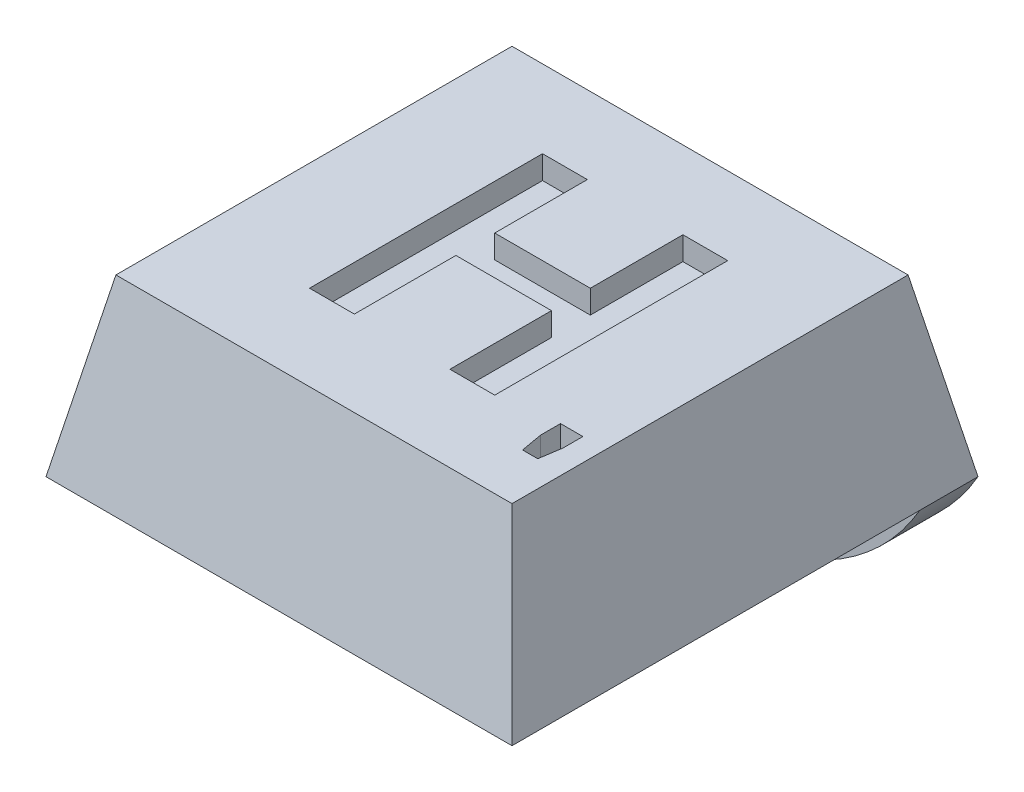
ISO-10303-21;
HEADER;
FILE_DESCRIPTION(('STEP AP214'),'2;1');
FILE_NAME('part.step','',(''),(''),'','','');
FILE_SCHEMA(('AUTOMOTIVE_DESIGN { 1 0 10303 214 1 1 1 1 }'));
ENDSEC;
DATA;
#1=APPLICATION_CONTEXT('core data for automotive mechanical design processes');
#2=APPLICATION_PROTOCOL_DEFINITION('international standard','automotive_design',2000,#1);
#3=PRODUCT_CONTEXT('',#1,'mechanical');
#4=PRODUCT('Part','Part','',(#3));
#5=PRODUCT_RELATED_PRODUCT_CATEGORY('part','',(#4));
#6=PRODUCT_DEFINITION_FORMATION('','',#4);
#7=PRODUCT_DEFINITION_CONTEXT('part definition',#1,'design');
#8=PRODUCT_DEFINITION('design','',#6,#7);
#9=PRODUCT_DEFINITION_SHAPE('','',#8);
#10=(LENGTH_UNIT() NAMED_UNIT(*) SI_UNIT(.MILLI.,.METRE.));
#11=(NAMED_UNIT(*) PLANE_ANGLE_UNIT() SI_UNIT($,.RADIAN.));
#12=(NAMED_UNIT(*) SI_UNIT($,.STERADIAN.) SOLID_ANGLE_UNIT());
#13=UNCERTAINTY_MEASURE_WITH_UNIT(LENGTH_MEASURE(1.E-05),#10,'distance_accuracy_value','');
#14=(GEOMETRIC_REPRESENTATION_CONTEXT(3) GLOBAL_UNCERTAINTY_ASSIGNED_CONTEXT((#13)) GLOBAL_UNIT_ASSIGNED_CONTEXT((#10,
#11,#12)) REPRESENTATION_CONTEXT('',''));
#15=CARTESIAN_POINT('',(0.,0.,0.));
#16=DIRECTION('',(0.,0.,1.));
#17=DIRECTION('',(1.,0.,0.));
#18=AXIS2_PLACEMENT_3D('',#15,#16,#17);
#19=CARTESIAN_POINT('',(0.,3.,0.));
#20=DIRECTION('',(0.,-1.,0.));
#21=DIRECTION('',(0.,0.,-1.));
#22=AXIS2_PLACEMENT_3D('',#19,#20,#21);
#23=PLANE('',#22);
#24=DIRECTION('',(-1.,0.,0.));
#25=VECTOR('',#24,1.);
#26=CARTESIAN_POINT('',(3.22863627000197,3.,-2.06454333683485));
#27=LINE('',#26,#25);
#28=CARTESIAN_POINT('',(3.22863627000197,3.,-2.06454333683485));
#29=VERTEX_POINT('',#28);
#30=CARTESIAN_POINT('',(2.4594055007712,3.,-2.06454333683485));
#31=VERTEX_POINT('',#30);
#32=EDGE_CURVE('E66',#29,#31,#27,.T.);
#33=ORIENTED_EDGE('',*,*,#32,.T.);
#34=DIRECTION('',(0.,0.,-1.));
#35=VECTOR('',#34,1.);
#36=CARTESIAN_POINT('',(2.4594055007712,3.,-2.06454333683485));
#37=LINE('',#36,#35);
#38=CARTESIAN_POINT('',(2.4594055007712,3.,-6.06454333683485));
#39=VERTEX_POINT('',#38);
#40=EDGE_CURVE('E239',#31,#39,#37,.T.);
#41=ORIENTED_EDGE('',*,*,#40,.T.);
#42=DIRECTION('',(1.,0.,0.));
#43=VECTOR('',#42,1.);
#44=CARTESIAN_POINT('',(2.4594055007712,3.,-6.06454333683485));
#45=LINE('',#44,#43);
#46=CARTESIAN_POINT('',(3.22863627000197,3.,-6.06454333683485));
#47=VERTEX_POINT('',#46);
#48=EDGE_CURVE('E287',#39,#47,#45,.T.);
#49=ORIENTED_EDGE('',*,*,#48,.T.);
#50=DIRECTION('',(0.,0.,1.));
#51=VECTOR('',#50,1.);
#52=CARTESIAN_POINT('',(3.22863627000197,3.,-6.06454333683485));
#53=LINE('',#52,#51);
#54=CARTESIAN_POINT('',(3.22863627000197,3.,-4.47479974709126));
#55=VERTEX_POINT('',#54);
#56=EDGE_CURVE('E291',#47,#55,#53,.T.);
#57=ORIENTED_EDGE('',*,*,#56,.T.);
#58=DIRECTION('',(1.,0.,0.));
#59=VECTOR('',#58,1.);
#60=CARTESIAN_POINT('',(3.22863627000197,3.,-4.47479974709126));
#61=LINE('',#60,#59);
#62=CARTESIAN_POINT('',(4.86966191102761,3.,-4.47479974709126));
#63=VERTEX_POINT('',#62);
#64=EDGE_CURVE('E295',#55,#63,#61,.T.);
#65=ORIENTED_EDGE('',*,*,#64,.T.);
#66=DIRECTION('',(0.,0.,-1.));
#67=VECTOR('',#66,1.);
#68=CARTESIAN_POINT('',(4.86966191102761,3.,-4.47479974709126));
#69=LINE('',#68,#67);
#70=CARTESIAN_POINT('',(4.86966191102761,3.,-6.06454333683485));
#71=VERTEX_POINT('',#70);
#72=EDGE_CURVE('E299',#63,#71,#69,.T.);
#73=ORIENTED_EDGE('',*,*,#72,.T.);
#74=DIRECTION('',(1.,0.,0.));
#75=VECTOR('',#74,1.);
#76=CARTESIAN_POINT('',(4.86966191102761,3.,-6.06454333683485));
#77=LINE('',#76,#75);
#78=CARTESIAN_POINT('',(5.63889268025838,3.,-6.06454333683485));
#79=VERTEX_POINT('',#78);
#80=EDGE_CURVE('E303',#71,#79,#77,.T.);
#81=ORIENTED_EDGE('',*,*,#80,.T.);
#82=DIRECTION('',(0.,0.,1.));
#83=VECTOR('',#82,1.);
#84=CARTESIAN_POINT('',(5.63889268025838,3.,-6.06454333683485));
#85=LINE('',#84,#83);
#86=CARTESIAN_POINT('',(5.63889268025838,3.,-2.06454333683485));
#87=VERTEX_POINT('',#86);
#88=EDGE_CURVE('E307',#79,#87,#85,.T.);
#89=ORIENTED_EDGE('',*,*,#88,.T.);
#90=DIRECTION('',(-1.,0.,0.));
#91=VECTOR('',#90,1.);
#92=CARTESIAN_POINT('',(5.63889268025838,3.,-2.06454333683485));
#93=LINE('',#92,#91);
#94=CARTESIAN_POINT('',(4.86966191102761,3.,-2.06454333683485));
#95=VERTEX_POINT('',#94);
#96=EDGE_CURVE('E311',#87,#95,#93,.T.);
#97=ORIENTED_EDGE('',*,*,#96,.T.);
#98=DIRECTION('',(0.,0.,-1.));
#99=VECTOR('',#98,1.);
#100=CARTESIAN_POINT('',(4.86966191102761,3.,-2.06454333683485));
#101=LINE('',#100,#99);
#102=CARTESIAN_POINT('',(4.86966191102761,3.,-3.80813308042459));
#103=VERTEX_POINT('',#102);
#104=EDGE_CURVE('E315',#95,#103,#101,.T.);
#105=ORIENTED_EDGE('',*,*,#104,.T.);
#106=DIRECTION('',(-1.,0.,0.));
#107=VECTOR('',#106,1.);
#108=CARTESIAN_POINT('',(4.86966191102761,3.,-3.80813308042459));
#109=LINE('',#108,#107);
#110=CARTESIAN_POINT('',(3.22863627000197,3.,-3.80813308042459));
#111=VERTEX_POINT('',#110);
#112=EDGE_CURVE('E319',#103,#111,#109,.T.);
#113=ORIENTED_EDGE('',*,*,#112,.T.);
#114=DIRECTION('',(0.,0.,1.));
#115=VECTOR('',#114,1.);
#116=CARTESIAN_POINT('',(3.22863627000197,3.,-3.80813308042459));
#117=LINE('',#116,#115);
#118=EDGE_CURVE('E250',#111,#29,#117,.T.);
#119=ORIENTED_EDGE('',*,*,#118,.T.);
#120=EDGE_LOOP('',(#33,#41,#49,#57,#65,#73,#81,#89,#97,#105,#113,#119));
#121=FACE_BOUND('',#120,.T.);
#122=DIRECTION('',(-1.,0.,0.));
#123=VECTOR('',#122,1.);
#124=CARTESIAN_POINT('',(11.,3.,-0.6));
#125=LINE('',#124,#123);
#126=CARTESIAN_POINT('',(7.4,3.,-0.6));
#127=VERTEX_POINT('',#126);
#128=CARTESIAN_POINT('',(0.6,3.,-0.6));
#129=VERTEX_POINT('',#128);
#130=EDGE_CURVE('E386',#127,#129,#125,.T.);
#131=ORIENTED_EDGE('',*,*,#130,.F.);
#132=DIRECTION('',(0.,0.,1.));
#133=VECTOR('',#132,1.);
#134=CARTESIAN_POINT('',(7.4,3.,-8.));
#135=LINE('',#134,#133);
#136=CARTESIAN_POINT('',(7.4,3.,-7.4));
#137=VERTEX_POINT('',#136);
#138=EDGE_CURVE('E399',#137,#127,#135,.T.);
#139=ORIENTED_EDGE('',*,*,#138,.F.);
#140=DIRECTION('',(-1.,0.,0.));
#141=VECTOR('',#140,1.);
#142=CARTESIAN_POINT('',(11.,3.,-7.4));
#143=LINE('',#142,#141);
#144=CARTESIAN_POINT('',(0.599999999999999,3.,-7.4));
#145=VERTEX_POINT('',#144);
#146=EDGE_CURVE('E382',#137,#145,#143,.T.);
#147=ORIENTED_EDGE('',*,*,#146,.T.);
#148=DIRECTION('',(0.,0.,1.));
#149=VECTOR('',#148,1.);
#150=CARTESIAN_POINT('',(0.6,3.,-8.));
#151=LINE('',#150,#149);
#152=EDGE_CURVE('E402',#145,#129,#151,.T.);
#153=ORIENTED_EDGE('',*,*,#152,.T.);
#154=EDGE_LOOP('',(#131,#139,#147,#153));
#155=FACE_BOUND('',#154,.T.);
#156=DIRECTION('',(-1.,0.,0.));
#157=VECTOR('',#156,1.);
#158=CARTESIAN_POINT('',(6.95345110897488,3.,-1.48827418732116));
#159=LINE('',#158,#157);
#160=CARTESIAN_POINT('',(6.95345110897488,3.,-1.48827418732116));
#161=VERTEX_POINT('',#160);
#162=CARTESIAN_POINT('',(6.69303444230821,3.,-1.48827418732116));
#163=VERTEX_POINT('',#162);
#164=EDGE_CURVE('E58',#161,#163,#159,.T.);
#165=ORIENTED_EDGE('',*,*,#164,.T.);
#166=DIRECTION('',(-0.174084452164286,0.,-0.984730726399182));
#167=VECTOR('',#166,1.);
#168=CARTESIAN_POINT('',(6.69303444230821,3.,-1.48827418732116));
#169=LINE('',#168,#167);
#170=CARTESIAN_POINT('',(6.6265280320518,3.,-1.86447611039809));
#171=VERTEX_POINT('',#170);
#172=EDGE_CURVE('E233',#163,#171,#169,.T.);
#173=ORIENTED_EDGE('',*,*,#172,.T.);
#174=DIRECTION('',(0.,0.,-1.));
#175=VECTOR('',#174,1.);
#176=CARTESIAN_POINT('',(6.6265280320518,3.,-1.86447611039809));
#177=LINE('',#176,#175);
#178=CARTESIAN_POINT('',(6.6265280320518,3.,-2.20622290526988));
#179=VERTEX_POINT('',#178);
#180=EDGE_CURVE('E506',#171,#179,#177,.T.);
#181=ORIENTED_EDGE('',*,*,#180,.T.);
#182=DIRECTION('',(1.,0.,0.));
#183=VECTOR('',#182,1.);
#184=CARTESIAN_POINT('',(6.6265280320518,3.,-2.20622290526988));
#185=LINE('',#184,#183);
#186=CARTESIAN_POINT('',(7.01114341666719,3.,-2.20622290526988));
#187=VERTEX_POINT('',#186);
#188=EDGE_CURVE('E514',#179,#187,#185,.T.);
#189=ORIENTED_EDGE('',*,*,#188,.T.);
#190=DIRECTION('',(0.,0.,1.));
#191=VECTOR('',#190,1.);
#192=CARTESIAN_POINT('',(7.01114341666719,3.,-2.20622290526988));
#193=LINE('',#192,#191);
#194=CARTESIAN_POINT('',(7.01114341666719,3.,-1.86447611039809));
#195=VERTEX_POINT('',#194);
#196=EDGE_CURVE('E518',#187,#195,#193,.T.);
#197=ORIENTED_EDGE('',*,*,#196,.T.);
#198=DIRECTION('',(-0.151582558519476,0.,0.98844460034576));
#199=VECTOR('',#198,1.);
#200=CARTESIAN_POINT('',(7.01114341666719,3.,-1.86447611039809));
#201=LINE('',#200,#199);
#202=EDGE_CURVE('E229',#195,#161,#201,.T.);
#203=ORIENTED_EDGE('',*,*,#202,.T.);
#204=EDGE_LOOP('',(#165,#173,#181,#189,#197,#203));
#205=FACE_BOUND('',#204,.T.);
#206=ADVANCED_FACE('F42',(#121,#155,#205),#23,.F.);
#207=CARTESIAN_POINT('',(8.,0.,-8.));
#208=DIRECTION('',(-0.98058067569092,-0.196116135138184,0.));
#209=DIRECTION('',(0.196116135138184,-0.98058067569092,0.));
#210=AXIS2_PLACEMENT_3D('',#207,#208,#209);
#211=PLANE('',#210);
#212=DIRECTION('',(-0.192450089729875,0.962250448649376,-0.192450089729875));
#213=VECTOR('',#212,1.);
#214=CARTESIAN_POINT('',(7.7037037037037,1.48148148148148,-0.296296296296296));
#215=LINE('',#214,#213);
#216=CARTESIAN_POINT('',(8.,0.,0.));
#217=VERTEX_POINT('',#216);
#218=EDGE_CURVE('E396',#217,#127,#215,.T.);
#219=ORIENTED_EDGE('',*,*,#218,.F.);
#220=DIRECTION('',(0.,0.,-1.));
#221=VECTOR('',#220,1.);
#222=CARTESIAN_POINT('',(8.,0.,0.));
#223=LINE('',#222,#221);
#224=CARTESIAN_POINT('',(8.,0.,-7.));
#225=VERTEX_POINT('',#224);
#226=EDGE_CURVE('E415',#217,#225,#223,.T.);
#227=ORIENTED_EDGE('',*,*,#226,.T.);
#228=DIRECTION('',(0.,0.,1.));
#229=VECTOR('',#228,1.);
#230=CARTESIAN_POINT('',(8.,0.,-8.));
#231=LINE('',#230,#229);
#232=CARTESIAN_POINT('',(8.,0.,-8.));
#233=VERTEX_POINT('',#232);
#234=EDGE_CURVE('E361',#233,#225,#231,.T.);
#235=ORIENTED_EDGE('',*,*,#234,.F.);
#236=DIRECTION('',(0.192450089729875,-0.962250448649376,-0.192450089729875));
#237=VECTOR('',#236,1.);
#238=CARTESIAN_POINT('',(8.,0.,-8.));
#239=LINE('',#238,#237);
#240=EDGE_CURVE('E389',#137,#233,#239,.T.);
#241=ORIENTED_EDGE('',*,*,#240,.F.);
#242=ORIENTED_EDGE('',*,*,#138,.T.);
#243=EDGE_LOOP('',(#219,#227,#235,#241,#242));
#244=FACE_BOUND('',#243,.T.);
#245=ADVANCED_FACE('F488',(#244),#211,.F.);
#246=CARTESIAN_POINT('',(0.,0.,-8.));
#247=DIRECTION('',(0.98058067569092,-0.196116135138184,0.));
#248=DIRECTION('',(0.196116135138184,0.98058067569092,0.));
#249=AXIS2_PLACEMENT_3D('',#246,#247,#248);
#250=PLANE('',#249);
#251=DIRECTION('',(-0.192450089729875,-0.962250448649376,0.192450089729875));
#252=VECTOR('',#251,1.);
#253=CARTESIAN_POINT('',(0.296296296296296,1.48148148148148,-0.296296296296296));
#254=LINE('',#253,#252);
#255=CARTESIAN_POINT('',(0.,0.,0.));
#256=VERTEX_POINT('',#255);
#257=EDGE_CURVE('E443',#129,#256,#254,.T.);
#258=ORIENTED_EDGE('',*,*,#257,.F.);
#259=ORIENTED_EDGE('',*,*,#152,.F.);
#260=DIRECTION('',(0.192450089729875,0.962250448649376,0.192450089729875));
#261=VECTOR('',#260,1.);
#262=CARTESIAN_POINT('',(0.,0.,-8.));
#263=LINE('',#262,#261);
#264=CARTESIAN_POINT('',(0.,0.,-8.));
#265=VERTEX_POINT('',#264);
#266=EDGE_CURVE('E414',#265,#145,#263,.T.);
#267=ORIENTED_EDGE('',*,*,#266,.F.);
#268=DIRECTION('',(0.,0.,1.));
#269=VECTOR('',#268,1.);
#270=CARTESIAN_POINT('',(0.,0.,0.));
#271=LINE('',#270,#269);
#272=CARTESIAN_POINT('',(0.,0.,-7.));
#273=VERTEX_POINT('',#272);
#274=EDGE_CURVE('E419',#265,#273,#271,.T.);
#275=ORIENTED_EDGE('',*,*,#274,.T.);
#276=EDGE_CURVE('E406',#273,#256,#271,.T.);
#277=ORIENTED_EDGE('',*,*,#276,.T.);
#278=EDGE_LOOP('',(#258,#259,#267,#275,#277));
#279=FACE_BOUND('',#278,.T.);
#280=ADVANCED_FACE('F468',(#279),#250,.F.);
#281=CARTESIAN_POINT('',(0.,0.,0.));
#282=DIRECTION('',(0.,-1.,0.));
#283=DIRECTION('',(0.,0.,-1.));
#284=AXIS2_PLACEMENT_3D('',#281,#282,#283);
#285=PLANE('',#284);
#286=DIRECTION('',(-1.,0.,0.));
#287=VECTOR('',#286,1.);
#288=CARTESIAN_POINT('',(0.,0.,-7.));
#289=LINE('',#288,#287);
#290=EDGE_CURVE('E367',#225,#273,#289,.T.);
#291=ORIENTED_EDGE('',*,*,#290,.F.);
#292=ORIENTED_EDGE('',*,*,#226,.F.);
#293=DIRECTION('',(1.,0.,0.));
#294=VECTOR('',#293,1.);
#295=CARTESIAN_POINT('',(0.,0.,0.));
#296=LINE('',#295,#294);
#297=EDGE_CURVE('E416',#256,#217,#296,.T.);
#298=ORIENTED_EDGE('',*,*,#297,.F.);
#299=ORIENTED_EDGE('',*,*,#276,.F.);
#300=EDGE_LOOP('',(#291,#292,#298,#299));
#301=FACE_BOUND('',#300,.T.);
#302=CARTESIAN_POINT('',(4.,0.,-3.75));
#303=DIRECTION('',(0.,-1.,0.));
#304=DIRECTION('',(0.,0.,-1.));
#305=AXIS2_PLACEMENT_3D('',#302,#303,#304);
#306=CIRCLE('',#305,1.8);
#307=CARTESIAN_POINT('',(4.,0.,-5.55));
#308=VERTEX_POINT('',#307);
#309=EDGE_CURVE('E371',#308,#308,#306,.T.);
#310=ORIENTED_EDGE('',*,*,#309,.F.);
#311=EDGE_LOOP('',(#310));
#312=FACE_BOUND('',#311,.T.);
#313=ADVANCED_FACE('F483',(#301,#312),#285,.T.);
#314=CARTESIAN_POINT('',(11.,3.,-7.4));
#315=DIRECTION('',(0.,0.196116135138184,-0.98058067569092));
#316=DIRECTION('',(0.,0.98058067569092,0.196116135138184));
#317=AXIS2_PLACEMENT_3D('',#314,#315,#316);
#318=PLANE('',#317);
#319=ORIENTED_EDGE('',*,*,#240,.T.);
#320=DIRECTION('',(-1.,0.,0.));
#321=VECTOR('',#320,1.);
#322=CARTESIAN_POINT('',(0.,0.,-8.));
#323=LINE('',#322,#321);
#324=EDGE_CURVE('E410',#233,#265,#323,.T.);
#325=ORIENTED_EDGE('',*,*,#324,.T.);
#326=ORIENTED_EDGE('',*,*,#266,.T.);
#327=ORIENTED_EDGE('',*,*,#146,.F.);
#328=EDGE_LOOP('',(#319,#325,#326,#327));
#329=FACE_BOUND('',#328,.T.);
#330=ADVANCED_FACE('F463',(#329),#318,.T.);
#331=CARTESIAN_POINT('',(11.,0.,0.));
#332=DIRECTION('',(0.,0.196116135138184,0.98058067569092));
#333=DIRECTION('',(0.,-0.98058067569092,0.196116135138184));
#334=AXIS2_PLACEMENT_3D('',#331,#332,#333);
#335=PLANE('',#334);
#336=ORIENTED_EDGE('',*,*,#218,.T.);
#337=ORIENTED_EDGE('',*,*,#130,.T.);
#338=ORIENTED_EDGE('',*,*,#257,.T.);
#339=ORIENTED_EDGE('',*,*,#297,.T.);
#340=EDGE_LOOP('',(#336,#337,#338,#339));
#341=FACE_BOUND('',#340,.T.);
#342=ADVANCED_FACE('F492',(#341),#335,.T.);
#343=CARTESIAN_POINT('',(4.,0.8,-3.75));
#344=DIRECTION('',(0.,-1.,0.));
#345=DIRECTION('',(0.,0.,-1.));
#346=AXIS2_PLACEMENT_3D('',#343,#344,#345);
#347=CYLINDRICAL_SURFACE('',#346,1.8);
#348=CARTESIAN_POINT('',(4.,0.8,-3.75));
#349=DIRECTION('',(0.,-1.,0.));
#350=DIRECTION('',(0.,0.,-1.));
#351=AXIS2_PLACEMENT_3D('',#348,#349,#350);
#352=CIRCLE('',#351,1.8);
#353=CARTESIAN_POINT('',(4.,0.8,-5.55));
#354=VERTEX_POINT('',#353);
#355=EDGE_CURVE('E378',#354,#354,#352,.T.);
#356=ORIENTED_EDGE('',*,*,#355,.F.);
#357=EDGE_LOOP('',(#356));
#358=FACE_BOUND('',#357,.T.);
#359=ORIENTED_EDGE('',*,*,#309,.T.);
#360=EDGE_LOOP('',(#359));
#361=FACE_BOUND('',#360,.T.);
#362=ADVANCED_FACE('F631',(#358,#361),#347,.F.);
#363=CARTESIAN_POINT('',(4.,0.8,-3.75));
#364=DIRECTION('',(0.,-1.,0.));
#365=DIRECTION('',(0.,0.,-1.));
#366=AXIS2_PLACEMENT_3D('',#363,#364,#365);
#367=PLANE('',#366);
#368=ORIENTED_EDGE('',*,*,#355,.T.);
#369=EDGE_LOOP('',(#368));
#370=FACE_BOUND('',#369,.T.);
#371=ADVANCED_FACE('F628',(#370),#367,.T.);
#372=CARTESIAN_POINT('',(0.,-2.,-8.));
#373=DIRECTION('',(0.,0.,1.));
#374=DIRECTION('',(1.,0.,0.));
#375=AXIS2_PLACEMENT_3D('',#372,#373,#374);
#376=PLANE('',#375);
#377=ORIENTED_EDGE('',*,*,#324,.F.);
#378=CARTESIAN_POINT('',(4.53589838486225,2.,-8.));
#379=DIRECTION('',(0.,0.,1.));
#380=DIRECTION('',(1.,0.,0.));
#381=AXIS2_PLACEMENT_3D('',#378,#379,#380);
#382=CIRCLE('',#381,4.);
#383=CARTESIAN_POINT('',(4.53589838486225,-2.,-8.));
#384=VERTEX_POINT('',#383);
#385=EDGE_CURVE('E11',#233,#384,#382,.F.);
#386=ORIENTED_EDGE('',*,*,#385,.T.);
#387=DIRECTION('',(1.,0.,0.));
#388=VECTOR('',#387,1.);
#389=CARTESIAN_POINT('',(0.,-2.,-8.));
#390=LINE('',#389,#388);
#391=CARTESIAN_POINT('',(3.46410161513775,-2.,-8.));
#392=VERTEX_POINT('',#391);
#393=EDGE_CURVE('E362',#392,#384,#390,.T.);
#394=ORIENTED_EDGE('',*,*,#393,.F.);
#395=CARTESIAN_POINT('',(3.46410161513775,2.,-8.));
#396=DIRECTION('',(0.,0.,1.));
#397=DIRECTION('',(1.,0.,0.));
#398=AXIS2_PLACEMENT_3D('',#395,#396,#397);
#399=CIRCLE('',#398,4.);
#400=EDGE_CURVE('E51',#392,#265,#399,.F.);
#401=ORIENTED_EDGE('',*,*,#400,.T.);
#402=EDGE_LOOP('',(#377,#386,#394,#401));
#403=FACE_BOUND('',#402,.T.);
#404=ADVANCED_FACE('F456',(#403),#376,.F.);
#405=CARTESIAN_POINT('',(0.,-2.,-7.));
#406=DIRECTION('',(0.,0.,-1.));
#407=DIRECTION('',(-1.,0.,0.));
#408=AXIS2_PLACEMENT_3D('',#405,#406,#407);
#409=PLANE('',#408);
#410=DIRECTION('',(-1.,0.,0.));
#411=VECTOR('',#410,1.);
#412=CARTESIAN_POINT('',(0.,-2.,-7.));
#413=LINE('',#412,#411);
#414=CARTESIAN_POINT('',(4.53589838486225,-2.,-7.));
#415=VERTEX_POINT('',#414);
#416=CARTESIAN_POINT('',(3.46410161513775,-2.,-7.));
#417=VERTEX_POINT('',#416);
#418=EDGE_CURVE('E366',#415,#417,#413,.T.);
#419=ORIENTED_EDGE('',*,*,#418,.F.);
#420=CARTESIAN_POINT('',(4.53589838486225,2.,-7.));
#421=DIRECTION('',(0.,0.,-1.));
#422=DIRECTION('',(-1.,0.,0.));
#423=AXIS2_PLACEMENT_3D('',#420,#421,#422);
#424=CIRCLE('',#423,4.);
#425=EDGE_CURVE('E450',#415,#225,#424,.F.);
#426=ORIENTED_EDGE('',*,*,#425,.T.);
#427=ORIENTED_EDGE('',*,*,#290,.T.);
#428=CARTESIAN_POINT('',(3.46410161513775,2.,-7.));
#429=DIRECTION('',(0.,0.,-1.));
#430=DIRECTION('',(-1.,0.,0.));
#431=AXIS2_PLACEMENT_3D('',#428,#429,#430);
#432=CIRCLE('',#431,4.);
#433=EDGE_CURVE('E447',#273,#417,#432,.F.);
#434=ORIENTED_EDGE('',*,*,#433,.T.);
#435=EDGE_LOOP('',(#419,#426,#427,#434));
#436=FACE_BOUND('',#435,.T.);
#437=ADVANCED_FACE('F474',(#436),#409,.F.);
#438=CARTESIAN_POINT('',(0.,-2.,0.));
#439=DIRECTION('',(0.,1.,0.));
#440=DIRECTION('',(0.,0.,1.));
#441=AXIS2_PLACEMENT_3D('',#438,#439,#440);
#442=PLANE('',#441);
#443=ORIENTED_EDGE('',*,*,#393,.T.);
#444=DIRECTION('',(0.,0.,1.));
#445=VECTOR('',#444,1.);
#446=CARTESIAN_POINT('',(4.53589838486225,-2.,0.));
#447=LINE('',#446,#445);
#448=EDGE_CURVE('E442',#384,#415,#447,.T.);
#449=ORIENTED_EDGE('',*,*,#448,.T.);
#450=ORIENTED_EDGE('',*,*,#418,.T.);
#451=DIRECTION('',(0.,0.,-1.));
#452=VECTOR('',#451,1.);
#453=CARTESIAN_POINT('',(3.46410161513775,-2.,0.));
#454=LINE('',#453,#452);
#455=EDGE_CURVE('E438',#417,#392,#454,.T.);
#456=ORIENTED_EDGE('',*,*,#455,.T.);
#457=EDGE_LOOP('',(#443,#449,#450,#456));
#458=FACE_BOUND('',#457,.T.);
#459=ADVANCED_FACE('F477',(#458),#442,.F.);
#460=CARTESIAN_POINT('',(4.53589838486225,2.,-8.));
#461=DIRECTION('',(0.,0.,1.));
#462=DIRECTION('',(1.,0.,0.));
#463=AXIS2_PLACEMENT_3D('',#460,#461,#462);
#464=CYLINDRICAL_SURFACE('',#463,4.);
#465=ORIENTED_EDGE('',*,*,#385,.F.);
#466=ORIENTED_EDGE('',*,*,#234,.T.);
#467=ORIENTED_EDGE('',*,*,#425,.F.);
#468=ORIENTED_EDGE('',*,*,#448,.F.);
#469=EDGE_LOOP('',(#465,#466,#467,#468));
#470=FACE_BOUND('',#469,.T.);
#471=ADVANCED_FACE('F480',(#470),#464,.T.);
#472=CARTESIAN_POINT('',(3.46410161513775,2.,-8.));
#473=DIRECTION('',(0.,0.,-1.));
#474=DIRECTION('',(-1.,0.,0.));
#475=AXIS2_PLACEMENT_3D('',#472,#473,#474);
#476=CYLINDRICAL_SURFACE('',#475,4.);
#477=ORIENTED_EDGE('',*,*,#433,.F.);
#478=ORIENTED_EDGE('',*,*,#274,.F.);
#479=ORIENTED_EDGE('',*,*,#400,.F.);
#480=ORIENTED_EDGE('',*,*,#455,.F.);
#481=EDGE_LOOP('',(#477,#478,#479,#480));
#482=FACE_BOUND('',#481,.T.);
#483=ADVANCED_FACE('F44',(#482),#476,.T.);
#484=CARTESIAN_POINT('',(3.22863627000197,2.6,-2.06454333683485));
#485=DIRECTION('',(0.,0.,-1.));
#486=DIRECTION('',(-1.,0.,0.));
#487=AXIS2_PLACEMENT_3D('',#484,#485,#486);
#488=PLANE('',#487);
#489=ORIENTED_EDGE('',*,*,#32,.F.);
#490=DIRECTION('',(0.,1.,0.));
#491=VECTOR('',#490,1.);
#492=CARTESIAN_POINT('',(3.22863627000197,2.6,-2.06454333683485));
#493=LINE('',#492,#491);
#494=CARTESIAN_POINT('',(3.22863627000197,2.6,-2.06454333683485));
#495=VERTEX_POINT('',#494);
#496=EDGE_CURVE('E282',#495,#29,#493,.T.);
#497=ORIENTED_EDGE('',*,*,#496,.F.);
#498=DIRECTION('',(-1.,0.,0.));
#499=VECTOR('',#498,1.);
#500=CARTESIAN_POINT('',(3.22863627000197,2.6,-2.06454333683485));
#501=LINE('',#500,#499);
#502=CARTESIAN_POINT('',(2.4594055007712,2.6,-2.06454333683485));
#503=VERTEX_POINT('',#502);
#504=EDGE_CURVE('E245',#495,#503,#501,.T.);
#505=ORIENTED_EDGE('',*,*,#504,.T.);
#506=DIRECTION('',(0.,1.,0.));
#507=VECTOR('',#506,1.);
#508=CARTESIAN_POINT('',(2.4594055007712,2.6,-2.06454333683485));
#509=LINE('',#508,#507);
#510=EDGE_CURVE('E358',#503,#31,#509,.T.);
#511=ORIENTED_EDGE('',*,*,#510,.T.);
#512=EDGE_LOOP('',(#489,#497,#505,#511));
#513=FACE_BOUND('',#512,.T.);
#514=ADVANCED_FACE('F618',(#513),#488,.T.);
#515=CARTESIAN_POINT('',(2.4594055007712,2.6,-2.06454333683485));
#516=DIRECTION('',(1.,0.,0.));
#517=DIRECTION('',(0.,0.,-1.));
#518=AXIS2_PLACEMENT_3D('',#515,#516,#517);
#519=PLANE('',#518);
#520=ORIENTED_EDGE('',*,*,#40,.F.);
#521=ORIENTED_EDGE('',*,*,#510,.F.);
#522=DIRECTION('',(0.,0.,-1.));
#523=VECTOR('',#522,1.);
#524=CARTESIAN_POINT('',(2.4594055007712,2.6,-2.06454333683485));
#525=LINE('',#524,#523);
#526=CARTESIAN_POINT('',(2.4594055007712,2.6,-6.06454333683485));
#527=VERTEX_POINT('',#526);
#528=EDGE_CURVE('E249',#503,#527,#525,.T.);
#529=ORIENTED_EDGE('',*,*,#528,.T.);
#530=DIRECTION('',(0.,1.,0.));
#531=VECTOR('',#530,1.);
#532=CARTESIAN_POINT('',(2.4594055007712,2.6,-6.06454333683485));
#533=LINE('',#532,#531);
#534=EDGE_CURVE('E355',#527,#39,#533,.T.);
#535=ORIENTED_EDGE('',*,*,#534,.T.);
#536=EDGE_LOOP('',(#520,#521,#529,#535));
#537=FACE_BOUND('',#536,.T.);
#538=ADVANCED_FACE('F614',(#537),#519,.T.);
#539=CARTESIAN_POINT('',(2.4594055007712,2.6,-6.06454333683485));
#540=DIRECTION('',(0.,0.,1.));
#541=DIRECTION('',(1.,0.,0.));
#542=AXIS2_PLACEMENT_3D('',#539,#540,#541);
#543=PLANE('',#542);
#544=ORIENTED_EDGE('',*,*,#48,.F.);
#545=ORIENTED_EDGE('',*,*,#534,.F.);
#546=DIRECTION('',(1.,0.,0.));
#547=VECTOR('',#546,1.);
#548=CARTESIAN_POINT('',(2.4594055007712,2.6,-6.06454333683485));
#549=LINE('',#548,#547);
#550=CARTESIAN_POINT('',(3.22863627000197,2.6,-6.06454333683485));
#551=VERTEX_POINT('',#550);
#552=EDGE_CURVE('E253',#527,#551,#549,.T.);
#553=ORIENTED_EDGE('',*,*,#552,.T.);
#554=DIRECTION('',(0.,1.,0.));
#555=VECTOR('',#554,1.);
#556=CARTESIAN_POINT('',(3.22863627000197,2.6,-6.06454333683485));
#557=LINE('',#556,#555);
#558=EDGE_CURVE('E352',#551,#47,#557,.T.);
#559=ORIENTED_EDGE('',*,*,#558,.T.);
#560=EDGE_LOOP('',(#544,#545,#553,#559));
#561=FACE_BOUND('',#560,.T.);
#562=ADVANCED_FACE('F610',(#561),#543,.T.);
#563=CARTESIAN_POINT('',(3.22863627000197,2.6,-6.06454333683485));
#564=DIRECTION('',(-1.,0.,0.));
#565=DIRECTION('',(0.,0.,1.));
#566=AXIS2_PLACEMENT_3D('',#563,#564,#565);
#567=PLANE('',#566);
#568=ORIENTED_EDGE('',*,*,#56,.F.);
#569=ORIENTED_EDGE('',*,*,#558,.F.);
#570=DIRECTION('',(0.,0.,1.));
#571=VECTOR('',#570,1.);
#572=CARTESIAN_POINT('',(3.22863627000197,2.6,-6.06454333683485));
#573=LINE('',#572,#571);
#574=CARTESIAN_POINT('',(3.22863627000197,2.6,-4.47479974709126));
#575=VERTEX_POINT('',#574);
#576=EDGE_CURVE('E256',#551,#575,#573,.T.);
#577=ORIENTED_EDGE('',*,*,#576,.T.);
#578=DIRECTION('',(0.,1.,0.));
#579=VECTOR('',#578,1.);
#580=CARTESIAN_POINT('',(3.22863627000197,2.6,-4.47479974709126));
#581=LINE('',#580,#579);
#582=EDGE_CURVE('E349',#575,#55,#581,.T.);
#583=ORIENTED_EDGE('',*,*,#582,.T.);
#584=EDGE_LOOP('',(#568,#569,#577,#583));
#585=FACE_BOUND('',#584,.T.);
#586=ADVANCED_FACE('F606',(#585),#567,.T.);
#587=CARTESIAN_POINT('',(3.22863627000197,2.6,-4.47479974709126));
#588=DIRECTION('',(0.,0.,1.));
#589=DIRECTION('',(1.,0.,0.));
#590=AXIS2_PLACEMENT_3D('',#587,#588,#589);
#591=PLANE('',#590);
#592=ORIENTED_EDGE('',*,*,#64,.F.);
#593=ORIENTED_EDGE('',*,*,#582,.F.);
#594=DIRECTION('',(1.,0.,0.));
#595=VECTOR('',#594,1.);
#596=CARTESIAN_POINT('',(3.22863627000197,2.6,-4.47479974709126));
#597=LINE('',#596,#595);
#598=CARTESIAN_POINT('',(4.86966191102761,2.6,-4.47479974709126));
#599=VERTEX_POINT('',#598);
#600=EDGE_CURVE('E259',#575,#599,#597,.T.);
#601=ORIENTED_EDGE('',*,*,#600,.T.);
#602=DIRECTION('',(0.,1.,0.));
#603=VECTOR('',#602,1.);
#604=CARTESIAN_POINT('',(4.86966191102761,2.6,-4.47479974709126));
#605=LINE('',#604,#603);
#606=EDGE_CURVE('E346',#599,#63,#605,.T.);
#607=ORIENTED_EDGE('',*,*,#606,.T.);
#608=EDGE_LOOP('',(#592,#593,#601,#607));
#609=FACE_BOUND('',#608,.T.);
#610=ADVANCED_FACE('F602',(#609),#591,.T.);
#611=CARTESIAN_POINT('',(4.86966191102761,2.6,-4.47479974709126));
#612=DIRECTION('',(1.,0.,0.));
#613=DIRECTION('',(0.,0.,-1.));
#614=AXIS2_PLACEMENT_3D('',#611,#612,#613);
#615=PLANE('',#614);
#616=ORIENTED_EDGE('',*,*,#72,.F.);
#617=ORIENTED_EDGE('',*,*,#606,.F.);
#618=DIRECTION('',(0.,0.,-1.));
#619=VECTOR('',#618,1.);
#620=CARTESIAN_POINT('',(4.86966191102761,2.6,-4.47479974709126));
#621=LINE('',#620,#619);
#622=CARTESIAN_POINT('',(4.86966191102761,2.6,-6.06454333683485));
#623=VERTEX_POINT('',#622);
#624=EDGE_CURVE('E262',#599,#623,#621,.T.);
#625=ORIENTED_EDGE('',*,*,#624,.T.);
#626=DIRECTION('',(0.,1.,0.));
#627=VECTOR('',#626,1.);
#628=CARTESIAN_POINT('',(4.86966191102761,2.6,-6.06454333683485));
#629=LINE('',#628,#627);
#630=EDGE_CURVE('E343',#623,#71,#629,.T.);
#631=ORIENTED_EDGE('',*,*,#630,.T.);
#632=EDGE_LOOP('',(#616,#617,#625,#631));
#633=FACE_BOUND('',#632,.T.);
#634=ADVANCED_FACE('F598',(#633),#615,.T.);
#635=CARTESIAN_POINT('',(4.86966191102761,2.6,-6.06454333683485));
#636=DIRECTION('',(0.,0.,1.));
#637=DIRECTION('',(1.,0.,0.));
#638=AXIS2_PLACEMENT_3D('',#635,#636,#637);
#639=PLANE('',#638);
#640=ORIENTED_EDGE('',*,*,#80,.F.);
#641=ORIENTED_EDGE('',*,*,#630,.F.);
#642=DIRECTION('',(1.,0.,0.));
#643=VECTOR('',#642,1.);
#644=CARTESIAN_POINT('',(4.86966191102761,2.6,-6.06454333683485));
#645=LINE('',#644,#643);
#646=CARTESIAN_POINT('',(5.63889268025838,2.6,-6.06454333683485));
#647=VERTEX_POINT('',#646);
#648=EDGE_CURVE('E265',#623,#647,#645,.T.);
#649=ORIENTED_EDGE('',*,*,#648,.T.);
#650=DIRECTION('',(0.,1.,0.));
#651=VECTOR('',#650,1.);
#652=CARTESIAN_POINT('',(5.63889268025838,2.6,-6.06454333683485));
#653=LINE('',#652,#651);
#654=EDGE_CURVE('E340',#647,#79,#653,.T.);
#655=ORIENTED_EDGE('',*,*,#654,.T.);
#656=EDGE_LOOP('',(#640,#641,#649,#655));
#657=FACE_BOUND('',#656,.T.);
#658=ADVANCED_FACE('F594',(#657),#639,.T.);
#659=CARTESIAN_POINT('',(5.63889268025838,2.6,-6.06454333683485));
#660=DIRECTION('',(-1.,0.,0.));
#661=DIRECTION('',(0.,0.,1.));
#662=AXIS2_PLACEMENT_3D('',#659,#660,#661);
#663=PLANE('',#662);
#664=ORIENTED_EDGE('',*,*,#88,.F.);
#665=ORIENTED_EDGE('',*,*,#654,.F.);
#666=DIRECTION('',(0.,0.,1.));
#667=VECTOR('',#666,1.);
#668=CARTESIAN_POINT('',(5.63889268025838,2.6,-6.06454333683485));
#669=LINE('',#668,#667);
#670=CARTESIAN_POINT('',(5.63889268025838,2.6,-2.06454333683485));
#671=VERTEX_POINT('',#670);
#672=EDGE_CURVE('E268',#647,#671,#669,.T.);
#673=ORIENTED_EDGE('',*,*,#672,.T.);
#674=DIRECTION('',(0.,1.,0.));
#675=VECTOR('',#674,1.);
#676=CARTESIAN_POINT('',(5.63889268025838,2.6,-2.06454333683485));
#677=LINE('',#676,#675);
#678=EDGE_CURVE('E337',#671,#87,#677,.T.);
#679=ORIENTED_EDGE('',*,*,#678,.T.);
#680=EDGE_LOOP('',(#664,#665,#673,#679));
#681=FACE_BOUND('',#680,.T.);
#682=ADVANCED_FACE('F590',(#681),#663,.T.);
#683=CARTESIAN_POINT('',(5.63889268025838,2.6,-2.06454333683485));
#684=DIRECTION('',(0.,0.,-1.));
#685=DIRECTION('',(-1.,0.,0.));
#686=AXIS2_PLACEMENT_3D('',#683,#684,#685);
#687=PLANE('',#686);
#688=ORIENTED_EDGE('',*,*,#96,.F.);
#689=ORIENTED_EDGE('',*,*,#678,.F.);
#690=DIRECTION('',(-1.,0.,0.));
#691=VECTOR('',#690,1.);
#692=CARTESIAN_POINT('',(5.63889268025838,2.6,-2.06454333683485));
#693=LINE('',#692,#691);
#694=CARTESIAN_POINT('',(4.86966191102761,2.6,-2.06454333683485));
#695=VERTEX_POINT('',#694);
#696=EDGE_CURVE('E271',#671,#695,#693,.T.);
#697=ORIENTED_EDGE('',*,*,#696,.T.);
#698=DIRECTION('',(0.,1.,0.));
#699=VECTOR('',#698,1.);
#700=CARTESIAN_POINT('',(4.86966191102761,2.6,-2.06454333683485));
#701=LINE('',#700,#699);
#702=EDGE_CURVE('E334',#695,#95,#701,.T.);
#703=ORIENTED_EDGE('',*,*,#702,.T.);
#704=EDGE_LOOP('',(#688,#689,#697,#703));
#705=FACE_BOUND('',#704,.T.);
#706=ADVANCED_FACE('F586',(#705),#687,.T.);
#707=CARTESIAN_POINT('',(4.86966191102761,2.6,-2.06454333683485));
#708=DIRECTION('',(1.,0.,0.));
#709=DIRECTION('',(0.,0.,-1.));
#710=AXIS2_PLACEMENT_3D('',#707,#708,#709);
#711=PLANE('',#710);
#712=ORIENTED_EDGE('',*,*,#104,.F.);
#713=ORIENTED_EDGE('',*,*,#702,.F.);
#714=DIRECTION('',(0.,0.,-1.));
#715=VECTOR('',#714,1.);
#716=CARTESIAN_POINT('',(4.86966191102761,2.6,-2.06454333683485));
#717=LINE('',#716,#715);
#718=CARTESIAN_POINT('',(4.86966191102761,2.6,-3.80813308042459));
#719=VERTEX_POINT('',#718);
#720=EDGE_CURVE('E274',#695,#719,#717,.T.);
#721=ORIENTED_EDGE('',*,*,#720,.T.);
#722=DIRECTION('',(0.,1.,0.));
#723=VECTOR('',#722,1.);
#724=CARTESIAN_POINT('',(4.86966191102761,2.6,-3.80813308042459));
#725=LINE('',#724,#723);
#726=EDGE_CURVE('E331',#719,#103,#725,.T.);
#727=ORIENTED_EDGE('',*,*,#726,.T.);
#728=EDGE_LOOP('',(#712,#713,#721,#727));
#729=FACE_BOUND('',#728,.T.);
#730=ADVANCED_FACE('F582',(#729),#711,.T.);
#731=CARTESIAN_POINT('',(4.86966191102761,2.6,-3.80813308042459));
#732=DIRECTION('',(0.,0.,-1.));
#733=DIRECTION('',(-1.,0.,0.));
#734=AXIS2_PLACEMENT_3D('',#731,#732,#733);
#735=PLANE('',#734);
#736=ORIENTED_EDGE('',*,*,#112,.F.);
#737=ORIENTED_EDGE('',*,*,#726,.F.);
#738=DIRECTION('',(-1.,0.,0.));
#739=VECTOR('',#738,1.);
#740=CARTESIAN_POINT('',(4.86966191102761,2.6,-3.80813308042459));
#741=LINE('',#740,#739);
#742=CARTESIAN_POINT('',(3.22863627000197,2.6,-3.80813308042459));
#743=VERTEX_POINT('',#742);
#744=EDGE_CURVE('E277',#719,#743,#741,.T.);
#745=ORIENTED_EDGE('',*,*,#744,.T.);
#746=DIRECTION('',(0.,1.,0.));
#747=VECTOR('',#746,1.);
#748=CARTESIAN_POINT('',(3.22863627000197,2.6,-3.80813308042459));
#749=LINE('',#748,#747);
#750=EDGE_CURVE('E328',#743,#111,#749,.T.);
#751=ORIENTED_EDGE('',*,*,#750,.T.);
#752=EDGE_LOOP('',(#736,#737,#745,#751));
#753=FACE_BOUND('',#752,.T.);
#754=ADVANCED_FACE('F578',(#753),#735,.T.);
#755=CARTESIAN_POINT('',(3.22863627000197,2.6,-3.80813308042459));
#756=DIRECTION('',(-1.,0.,0.));
#757=DIRECTION('',(0.,0.,1.));
#758=AXIS2_PLACEMENT_3D('',#755,#756,#757);
#759=PLANE('',#758);
#760=ORIENTED_EDGE('',*,*,#118,.F.);
#761=ORIENTED_EDGE('',*,*,#750,.F.);
#762=DIRECTION('',(0.,0.,1.));
#763=VECTOR('',#762,1.);
#764=CARTESIAN_POINT('',(3.22863627000197,2.6,-3.80813308042459));
#765=LINE('',#764,#763);
#766=EDGE_CURVE('E280',#743,#495,#765,.T.);
#767=ORIENTED_EDGE('',*,*,#766,.T.);
#768=ORIENTED_EDGE('',*,*,#496,.T.);
#769=EDGE_LOOP('',(#760,#761,#767,#768));
#770=FACE_BOUND('',#769,.T.);
#771=ADVANCED_FACE('F574',(#770),#759,.T.);
#772=CARTESIAN_POINT('',(0.,2.6,0.));
#773=DIRECTION('',(0.,-1.,0.));
#774=DIRECTION('',(0.,0.,-1.));
#775=AXIS2_PLACEMENT_3D('',#772,#773,#774);
#776=PLANE('',#775);
#777=ORIENTED_EDGE('',*,*,#504,.F.);
#778=ORIENTED_EDGE('',*,*,#766,.F.);
#779=ORIENTED_EDGE('',*,*,#744,.F.);
#780=ORIENTED_EDGE('',*,*,#720,.F.);
#781=ORIENTED_EDGE('',*,*,#696,.F.);
#782=ORIENTED_EDGE('',*,*,#672,.F.);
#783=ORIENTED_EDGE('',*,*,#648,.F.);
#784=ORIENTED_EDGE('',*,*,#624,.F.);
#785=ORIENTED_EDGE('',*,*,#600,.F.);
#786=ORIENTED_EDGE('',*,*,#576,.F.);
#787=ORIENTED_EDGE('',*,*,#552,.F.);
#788=ORIENTED_EDGE('',*,*,#528,.F.);
#789=EDGE_LOOP('',(#777,#778,#779,#780,#781,#782,#783,#784,#785,#786,#787,#788));
#790=FACE_BOUND('',#789,.T.);
#791=ADVANCED_FACE('F571',(#790),#776,.F.);
#792=CARTESIAN_POINT('',(6.95345110897488,2.6,-1.48827418732116));
#793=DIRECTION('',(0.,0.,-1.));
#794=DIRECTION('',(-1.,0.,0.));
#795=AXIS2_PLACEMENT_3D('',#792,#793,#794);
#796=PLANE('',#795);
#797=ORIENTED_EDGE('',*,*,#164,.F.);
#798=DIRECTION('',(0.,1.,0.));
#799=VECTOR('',#798,1.);
#800=CARTESIAN_POINT('',(6.95345110897488,2.6,-1.48827418732116));
#801=LINE('',#800,#799);
#802=CARTESIAN_POINT('',(6.95345110897488,2.6,-1.48827418732116));
#803=VERTEX_POINT('',#802);
#804=EDGE_CURVE('E227',#803,#161,#801,.T.);
#805=ORIENTED_EDGE('',*,*,#804,.F.);
#806=DIRECTION('',(-1.,0.,0.));
#807=VECTOR('',#806,1.);
#808=CARTESIAN_POINT('',(6.95345110897488,2.6,-1.48827418732116));
#809=LINE('',#808,#807);
#810=CARTESIAN_POINT('',(6.69303444230821,2.6,-1.48827418732116));
#811=VERTEX_POINT('',#810);
#812=EDGE_CURVE('E217',#803,#811,#809,.T.);
#813=ORIENTED_EDGE('',*,*,#812,.T.);
#814=DIRECTION('',(0.,1.,0.));
#815=VECTOR('',#814,1.);
#816=CARTESIAN_POINT('',(6.69303444230821,2.6,-1.48827418732116));
#817=LINE('',#816,#815);
#818=EDGE_CURVE('E226',#811,#163,#817,.T.);
#819=ORIENTED_EDGE('',*,*,#818,.T.);
#820=EDGE_LOOP('',(#797,#805,#813,#819));
#821=FACE_BOUND('',#820,.T.);
#822=ADVANCED_FACE('F225',(#821),#796,.T.);
#823=CARTESIAN_POINT('',(6.69303444230821,2.6,-1.48827418732116));
#824=DIRECTION('',(0.984730726399182,0.,-0.174084452164286));
#825=DIRECTION('',(-0.174084452164286,0.,-0.984730726399182));
#826=AXIS2_PLACEMENT_3D('',#823,#824,#825);
#827=PLANE('',#826);
#828=ORIENTED_EDGE('',*,*,#172,.F.);
#829=ORIENTED_EDGE('',*,*,#818,.F.);
#830=DIRECTION('',(-0.174084452164286,0.,-0.984730726399182));
#831=VECTOR('',#830,1.);
#832=CARTESIAN_POINT('',(6.69303444230821,2.6,-1.48827418732116));
#833=LINE('',#832,#831);
#834=CARTESIAN_POINT('',(6.6265280320518,2.6,-1.86447611039809));
#835=VERTEX_POINT('',#834);
#836=EDGE_CURVE('E213',#811,#835,#833,.T.);
#837=ORIENTED_EDGE('',*,*,#836,.T.);
#838=DIRECTION('',(0.,1.,0.));
#839=VECTOR('',#838,1.);
#840=CARTESIAN_POINT('',(6.6265280320518,2.6,-1.86447611039809));
#841=LINE('',#840,#839);
#842=EDGE_CURVE('E235',#835,#171,#841,.T.);
#843=ORIENTED_EDGE('',*,*,#842,.T.);
#844=EDGE_LOOP('',(#828,#829,#837,#843));
#845=FACE_BOUND('',#844,.T.);
#846=ADVANCED_FACE('F231',(#845),#827,.T.);
#847=CARTESIAN_POINT('',(6.6265280320518,2.6,-1.86447611039809));
#848=DIRECTION('',(1.,0.,0.));
#849=DIRECTION('',(0.,0.,-1.));
#850=AXIS2_PLACEMENT_3D('',#847,#848,#849);
#851=PLANE('',#850);
#852=ORIENTED_EDGE('',*,*,#180,.F.);
#853=ORIENTED_EDGE('',*,*,#842,.F.);
#854=DIRECTION('',(0.,0.,-1.));
#855=VECTOR('',#854,1.);
#856=CARTESIAN_POINT('',(6.6265280320518,2.6,-1.86447611039809));
#857=LINE('',#856,#855);
#858=CARTESIAN_POINT('',(6.6265280320518,2.6,-2.20622290526988));
#859=VERTEX_POINT('',#858);
#860=EDGE_CURVE('E219',#835,#859,#857,.T.);
#861=ORIENTED_EDGE('',*,*,#860,.T.);
#862=DIRECTION('',(0.,1.,0.));
#863=VECTOR('',#862,1.);
#864=CARTESIAN_POINT('',(6.6265280320518,2.6,-2.20622290526988));
#865=LINE('',#864,#863);
#866=EDGE_CURVE('E241',#859,#179,#865,.T.);
#867=ORIENTED_EDGE('',*,*,#866,.T.);
#868=EDGE_LOOP('',(#852,#853,#861,#867));
#869=FACE_BOUND('',#868,.T.);
#870=ADVANCED_FACE('F535',(#869),#851,.T.);
#871=CARTESIAN_POINT('',(6.6265280320518,2.6,-2.20622290526988));
#872=DIRECTION('',(0.,0.,1.));
#873=DIRECTION('',(1.,0.,0.));
#874=AXIS2_PLACEMENT_3D('',#871,#872,#873);
#875=PLANE('',#874);
#876=ORIENTED_EDGE('',*,*,#188,.F.);
#877=ORIENTED_EDGE('',*,*,#866,.F.);
#878=DIRECTION('',(1.,0.,0.));
#879=VECTOR('',#878,1.);
#880=CARTESIAN_POINT('',(6.6265280320518,2.6,-2.20622290526988));
#881=LINE('',#880,#879);
#882=CARTESIAN_POINT('',(7.01114341666719,2.6,-2.20622290526988));
#883=VERTEX_POINT('',#882);
#884=EDGE_CURVE('E549',#859,#883,#881,.T.);
#885=ORIENTED_EDGE('',*,*,#884,.T.);
#886=DIRECTION('',(0.,1.,0.));
#887=VECTOR('',#886,1.);
#888=CARTESIAN_POINT('',(7.01114341666719,2.6,-2.20622290526988));
#889=LINE('',#888,#887);
#890=EDGE_CURVE('E528',#883,#187,#889,.T.);
#891=ORIENTED_EDGE('',*,*,#890,.T.);
#892=EDGE_LOOP('',(#876,#877,#885,#891));
#893=FACE_BOUND('',#892,.T.);
#894=ADVANCED_FACE('F537',(#893),#875,.T.);
#895=CARTESIAN_POINT('',(7.01114341666719,2.6,-2.20622290526988));
#896=DIRECTION('',(-1.,0.,0.));
#897=DIRECTION('',(0.,0.,1.));
#898=AXIS2_PLACEMENT_3D('',#895,#896,#897);
#899=PLANE('',#898);
#900=ORIENTED_EDGE('',*,*,#196,.F.);
#901=ORIENTED_EDGE('',*,*,#890,.F.);
#902=DIRECTION('',(0.,0.,1.));
#903=VECTOR('',#902,1.);
#904=CARTESIAN_POINT('',(7.01114341666719,2.6,-2.20622290526988));
#905=LINE('',#904,#903);
#906=CARTESIAN_POINT('',(7.01114341666719,2.6,-1.86447611039809));
#907=VERTEX_POINT('',#906);
#908=EDGE_CURVE('E544',#883,#907,#905,.T.);
#909=ORIENTED_EDGE('',*,*,#908,.T.);
#910=DIRECTION('',(0.,1.,0.));
#911=VECTOR('',#910,1.);
#912=CARTESIAN_POINT('',(7.01114341666719,2.6,-1.86447611039809));
#913=LINE('',#912,#911);
#914=EDGE_CURVE('E525',#907,#195,#913,.T.);
#915=ORIENTED_EDGE('',*,*,#914,.T.);
#916=EDGE_LOOP('',(#900,#901,#909,#915));
#917=FACE_BOUND('',#916,.T.);
#918=ADVANCED_FACE('F541',(#917),#899,.T.);
#919=CARTESIAN_POINT('',(7.01114341666719,2.6,-1.86447611039809));
#920=DIRECTION('',(-0.98844460034576,0.,-0.151582558519476));
#921=DIRECTION('',(-0.151582558519476,0.,0.98844460034576));
#922=AXIS2_PLACEMENT_3D('',#919,#920,#921);
#923=PLANE('',#922);
#924=ORIENTED_EDGE('',*,*,#202,.F.);
#925=ORIENTED_EDGE('',*,*,#914,.F.);
#926=DIRECTION('',(-0.151582558519476,0.,0.98844460034576));
#927=VECTOR('',#926,1.);
#928=CARTESIAN_POINT('',(7.01114341666719,2.6,-1.86447611039809));
#929=LINE('',#928,#927);
#930=EDGE_CURVE('E509',#907,#803,#929,.T.);
#931=ORIENTED_EDGE('',*,*,#930,.T.);
#932=ORIENTED_EDGE('',*,*,#804,.T.);
#933=EDGE_LOOP('',(#924,#925,#931,#932));
#934=FACE_BOUND('',#933,.T.);
#935=ADVANCED_FACE('F546',(#934),#923,.T.);
#936=CARTESIAN_POINT('',(0.,2.6,0.));
#937=DIRECTION('',(0.,-1.,0.));
#938=DIRECTION('',(0.,0.,-1.));
#939=AXIS2_PLACEMENT_3D('',#936,#937,#938);
#940=PLANE('',#939);
#941=ORIENTED_EDGE('',*,*,#812,.F.);
#942=ORIENTED_EDGE('',*,*,#930,.F.);
#943=ORIENTED_EDGE('',*,*,#908,.F.);
#944=ORIENTED_EDGE('',*,*,#884,.F.);
#945=ORIENTED_EDGE('',*,*,#860,.F.);
#946=ORIENTED_EDGE('',*,*,#836,.F.);
#947=EDGE_LOOP('',(#941,#942,#943,#944,#945,#946));
#948=FACE_BOUND('',#947,.T.);
#949=ADVANCED_FACE('F215',(#948),#940,.F.);
#950=CLOSED_SHELL('',(#206,#245,#280,#313,#330,#342,#362,#371,#404,#437,#459,#471,#483,#514,
#538,#562,#586,#610,#634,#658,#682,#706,#730,#754,#771,#791,#822,#846,#870,#894,#918,#935,#949));
#951=MANIFOLD_SOLID_BREP('B2',#950);
#952=ADVANCED_BREP_SHAPE_REPRESENTATION('',(#18,#951),#14);
#953=SHAPE_DEFINITION_REPRESENTATION(#9,#952);
ENDSEC;
END-ISO-10303-21;
